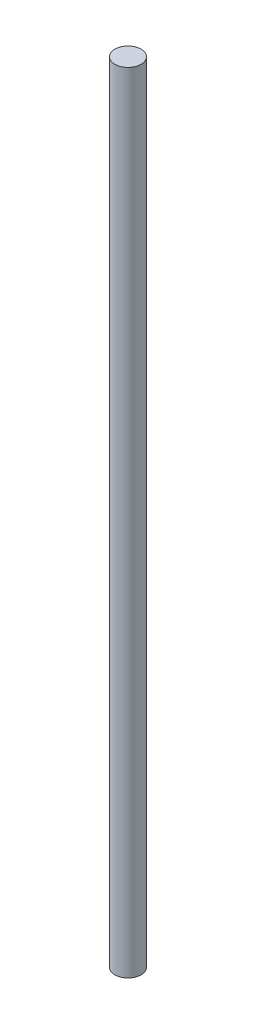
ISO-10303-21;
HEADER;
FILE_DESCRIPTION(('STEP AP214'),'2;1');
FILE_NAME('part.step','',(''),(''),'','','');
FILE_SCHEMA(('AUTOMOTIVE_DESIGN { 1 0 10303 214 1 1 1 1 }'));
ENDSEC;
DATA;
#1=APPLICATION_CONTEXT('core data for automotive mechanical design processes');
#2=APPLICATION_PROTOCOL_DEFINITION('international standard','automotive_design',2000,#1);
#3=PRODUCT_CONTEXT('',#1,'mechanical');
#4=PRODUCT('Part','Part','',(#3));
#5=PRODUCT_RELATED_PRODUCT_CATEGORY('part','',(#4));
#6=PRODUCT_DEFINITION_FORMATION('','',#4);
#7=PRODUCT_DEFINITION_CONTEXT('part definition',#1,'design');
#8=PRODUCT_DEFINITION('design','',#6,#7);
#9=PRODUCT_DEFINITION_SHAPE('','',#8);
#10=(LENGTH_UNIT() NAMED_UNIT(*) SI_UNIT(.MILLI.,.METRE.));
#11=(NAMED_UNIT(*) PLANE_ANGLE_UNIT() SI_UNIT($,.RADIAN.));
#12=(NAMED_UNIT(*) SI_UNIT($,.STERADIAN.) SOLID_ANGLE_UNIT());
#13=UNCERTAINTY_MEASURE_WITH_UNIT(LENGTH_MEASURE(1.E-05),#10,'distance_accuracy_value','');
#14=(GEOMETRIC_REPRESENTATION_CONTEXT(3) GLOBAL_UNCERTAINTY_ASSIGNED_CONTEXT((#13)) GLOBAL_UNIT_ASSIGNED_CONTEXT((#10,
#11,#12)) REPRESENTATION_CONTEXT('',''));
#15=CARTESIAN_POINT('',(0.,0.,0.));
#16=DIRECTION('',(0.,0.,1.));
#17=DIRECTION('',(1.,0.,0.));
#18=AXIS2_PLACEMENT_3D('',#15,#16,#17);
#19=CARTESIAN_POINT('',(0.,361.,0.));
#20=DIRECTION('',(0.,-1.,0.));
#21=DIRECTION('',(0.,0.,-1.));
#22=AXIS2_PLACEMENT_3D('',#19,#20,#21);
#23=CYLINDRICAL_SURFACE('',#22,6.);
#24=CARTESIAN_POINT('',(0.,361.,0.));
#25=DIRECTION('',(0.,1.,0.));
#26=DIRECTION('',(0.,0.,1.));
#27=AXIS2_PLACEMENT_3D('',#24,#25,#26);
#28=CIRCLE('',#27,6.);
#29=CARTESIAN_POINT('',(0.,361.,6.));
#30=VERTEX_POINT('',#29);
#31=EDGE_CURVE('E10',#30,#30,#28,.T.);
#32=ORIENTED_EDGE('',*,*,#31,.F.);
#33=EDGE_LOOP('',(#32));
#34=FACE_BOUND('',#33,.T.);
#35=CARTESIAN_POINT('',(0.,0.,0.));
#36=DIRECTION('',(0.,1.,0.));
#37=DIRECTION('',(0.,0.,1.));
#38=AXIS2_PLACEMENT_3D('',#35,#36,#37);
#39=CIRCLE('',#38,6.);
#40=CARTESIAN_POINT('',(0.,0.,6.));
#41=VERTEX_POINT('',#40);
#42=EDGE_CURVE('E33',#41,#41,#39,.T.);
#43=ORIENTED_EDGE('',*,*,#42,.T.);
#44=EDGE_LOOP('',(#43));
#45=FACE_BOUND('',#44,.T.);
#46=ADVANCED_FACE('F30',(#34,#45),#23,.T.);
#47=CARTESIAN_POINT('',(0.,361.,0.));
#48=DIRECTION('',(0.,1.,0.));
#49=DIRECTION('',(0.,0.,1.));
#50=AXIS2_PLACEMENT_3D('',#47,#48,#49);
#51=PLANE('',#50);
#52=ORIENTED_EDGE('',*,*,#31,.T.);
#53=EDGE_LOOP('',(#52));
#54=FACE_BOUND('',#53,.T.);
#55=ADVANCED_FACE('F45',(#54),#51,.T.);
#56=CARTESIAN_POINT('',(0.,0.,0.));
#57=DIRECTION('',(0.,1.,0.));
#58=DIRECTION('',(0.,0.,1.));
#59=AXIS2_PLACEMENT_3D('',#56,#57,#58);
#60=PLANE('',#59);
#61=ORIENTED_EDGE('',*,*,#42,.F.);
#62=EDGE_LOOP('',(#61));
#63=FACE_BOUND('',#62,.T.);
#64=ADVANCED_FACE('F43',(#63),#60,.F.);
#65=CLOSED_SHELL('',(#46,#55,#64));
#66=MANIFOLD_SOLID_BREP('B2',#65);
#67=ADVANCED_BREP_SHAPE_REPRESENTATION('',(#18,#66),#14);
#68=SHAPE_DEFINITION_REPRESENTATION(#9,#67);
ENDSEC;
END-ISO-10303-21;
